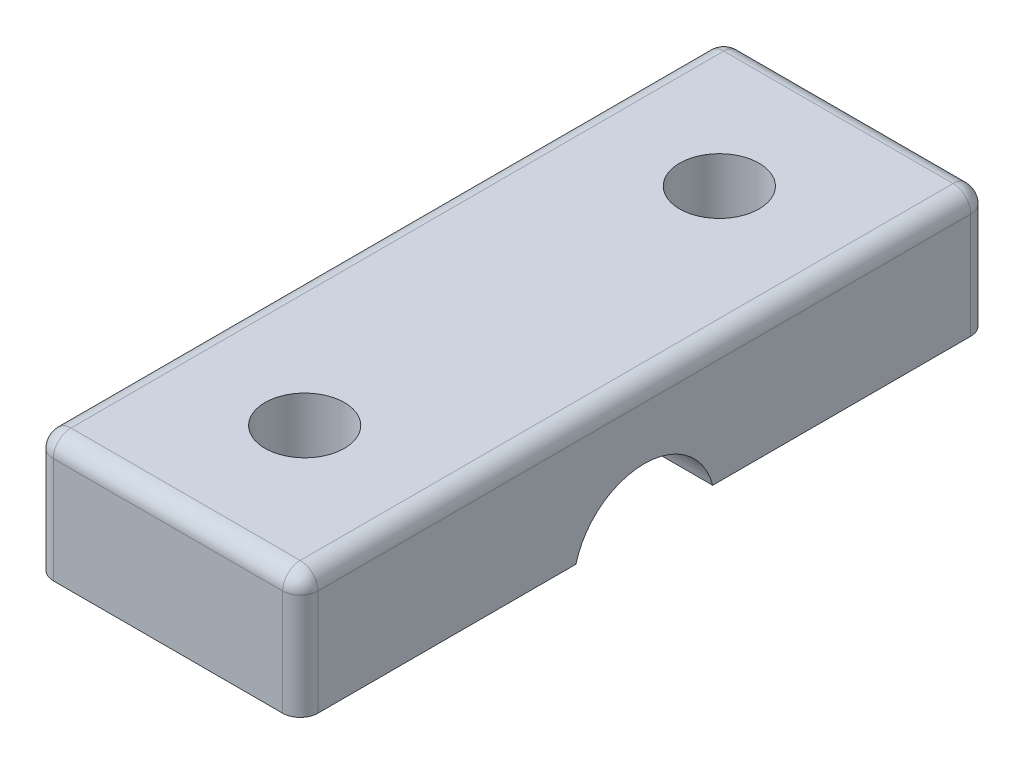
ISO-10303-21;
HEADER;
FILE_DESCRIPTION(('STEP AP214'),'2;1');
FILE_NAME('part.step','',(''),(''),'','','');
FILE_SCHEMA(('AUTOMOTIVE_DESIGN { 1 0 10303 214 1 1 1 1 }'));
ENDSEC;
DATA;
#1=APPLICATION_CONTEXT('core data for automotive mechanical design processes');
#2=APPLICATION_PROTOCOL_DEFINITION('international standard','automotive_design',2000,#1);
#3=PRODUCT_CONTEXT('',#1,'mechanical');
#4=PRODUCT('Part','Part','',(#3));
#5=PRODUCT_RELATED_PRODUCT_CATEGORY('part','',(#4));
#6=PRODUCT_DEFINITION_FORMATION('','',#4);
#7=PRODUCT_DEFINITION_CONTEXT('part definition',#1,'design');
#8=PRODUCT_DEFINITION('design','',#6,#7);
#9=PRODUCT_DEFINITION_SHAPE('','',#8);
#10=(LENGTH_UNIT() NAMED_UNIT(*) SI_UNIT(.MILLI.,.METRE.));
#11=(NAMED_UNIT(*) PLANE_ANGLE_UNIT() SI_UNIT($,.RADIAN.));
#12=(NAMED_UNIT(*) SI_UNIT($,.STERADIAN.) SOLID_ANGLE_UNIT());
#13=UNCERTAINTY_MEASURE_WITH_UNIT(LENGTH_MEASURE(1.E-05),#10,'distance_accuracy_value','');
#14=(GEOMETRIC_REPRESENTATION_CONTEXT(3) GLOBAL_UNCERTAINTY_ASSIGNED_CONTEXT((#13)) GLOBAL_UNIT_ASSIGNED_CONTEXT((#10,
#11,#12)) REPRESENTATION_CONTEXT('',''));
#15=CARTESIAN_POINT('',(0.,0.,0.));
#16=DIRECTION('',(0.,0.,1.));
#17=DIRECTION('',(1.,0.,0.));
#18=AXIS2_PLACEMENT_3D('',#15,#16,#17);
#19=CARTESIAN_POINT('',(0.,8.,0.));
#20=DIRECTION('',(0.,1.,0.));
#21=DIRECTION('',(0.,0.,1.));
#22=AXIS2_PLACEMENT_3D('',#19,#20,#21);
#23=PLANE('',#22);
#24=DIRECTION('',(0.,0.,-1.));
#25=VECTOR('',#24,1.);
#26=CARTESIAN_POINT('',(14.,8.,-39.));
#27=LINE('',#26,#25);
#28=CARTESIAN_POINT('',(14.,8.,-1.));
#29=VERTEX_POINT('',#28);
#30=CARTESIAN_POINT('',(14.,8.,-38.));
#31=VERTEX_POINT('',#30);
#32=EDGE_CURVE('E179',#29,#31,#27,.T.);
#33=ORIENTED_EDGE('',*,*,#32,.T.);
#34=DIRECTION('',(-1.,0.,0.));
#35=VECTOR('',#34,1.);
#36=CARTESIAN_POINT('',(0.,8.,-38.));
#37=LINE('',#36,#35);
#38=CARTESIAN_POINT('',(1.,8.,-38.));
#39=VERTEX_POINT('',#38);
#40=EDGE_CURVE('E183',#31,#39,#37,.T.);
#41=ORIENTED_EDGE('',*,*,#40,.T.);
#42=DIRECTION('',(0.,0.,1.));
#43=VECTOR('',#42,1.);
#44=CARTESIAN_POINT('',(1.,8.,0.));
#45=LINE('',#44,#43);
#46=CARTESIAN_POINT('',(1.,8.,-1.));
#47=VERTEX_POINT('',#46);
#48=EDGE_CURVE('E181',#39,#47,#45,.T.);
#49=ORIENTED_EDGE('',*,*,#48,.T.);
#50=DIRECTION('',(1.,0.,0.));
#51=VECTOR('',#50,1.);
#52=CARTESIAN_POINT('',(15.,8.,-1.));
#53=LINE('',#52,#51);
#54=EDGE_CURVE('E177',#47,#29,#53,.T.);
#55=ORIENTED_EDGE('',*,*,#54,.T.);
#56=EDGE_LOOP('',(#33,#41,#49,#55));
#57=FACE_BOUND('',#56,.T.);
#58=CARTESIAN_POINT('',(7.5,8.,-31.25));
#59=DIRECTION('',(0.,1.,0.));
#60=DIRECTION('',(0.,0.,1.));
#61=AXIS2_PLACEMENT_3D('',#58,#59,#60);
#62=CIRCLE('',#61,2.25);
#63=CARTESIAN_POINT('',(7.5,8.,-29.));
#64=VERTEX_POINT('',#63);
#65=EDGE_CURVE('E173',#64,#64,#62,.T.);
#66=ORIENTED_EDGE('',*,*,#65,.F.);
#67=EDGE_LOOP('',(#66));
#68=FACE_BOUND('',#67,.T.);
#69=CARTESIAN_POINT('',(7.5,8.,-7.75));
#70=DIRECTION('',(0.,1.,0.));
#71=DIRECTION('',(0.,0.,-1.));
#72=AXIS2_PLACEMENT_3D('',#69,#70,#71);
#73=CIRCLE('',#72,2.25);
#74=CARTESIAN_POINT('',(7.5,8.,-10.));
#75=VERTEX_POINT('',#74);
#76=EDGE_CURVE('E170',#75,#75,#73,.T.);
#77=ORIENTED_EDGE('',*,*,#76,.F.);
#78=EDGE_LOOP('',(#77));
#79=FACE_BOUND('',#78,.T.);
#80=ADVANCED_FACE('F36',(#57,#68,#79),#23,.T.);
#81=CARTESIAN_POINT('',(0.,8.,-39.));
#82=DIRECTION('',(1.,0.,0.));
#83=DIRECTION('',(0.,0.,-1.));
#84=AXIS2_PLACEMENT_3D('',#81,#82,#83);
#85=PLANE('',#84);
#86=CARTESIAN_POINT('',(0.,0.,-19.5));
#87=DIRECTION('',(-1.,0.,0.));
#88=DIRECTION('',(0.,0.,-1.));
#89=AXIS2_PLACEMENT_3D('',#86,#87,#88);
#90=CIRCLE('',#89,4.);
#91=CARTESIAN_POINT('',(0.,1.,-15.6270166537926));
#92=VERTEX_POINT('',#91);
#93=CARTESIAN_POINT('',(0.,1.,-23.3729833462074));
#94=VERTEX_POINT('',#93);
#95=EDGE_CURVE('E135',#92,#94,#90,.T.);
#96=ORIENTED_EDGE('',*,*,#95,.F.);
#97=DIRECTION('',(0.,0.,-1.));
#98=VECTOR('',#97,1.);
#99=CARTESIAN_POINT('',(0.,1.,4.69760280411851));
#100=LINE('',#99,#98);
#101=CARTESIAN_POINT('',(0.,1.,-1.));
#102=VERTEX_POINT('',#101);
#103=EDGE_CURVE('E131',#102,#92,#100,.T.);
#104=ORIENTED_EDGE('',*,*,#103,.F.);
#105=DIRECTION('',(0.,-1.,0.));
#106=VECTOR('',#105,1.);
#107=CARTESIAN_POINT('',(0.,8.,-1.));
#108=LINE('',#107,#106);
#109=CARTESIAN_POINT('',(0.,7.,-1.));
#110=VERTEX_POINT('',#109);
#111=EDGE_CURVE('E197',#102,#110,#108,.F.);
#112=ORIENTED_EDGE('',*,*,#111,.T.);
#113=DIRECTION('',(0.,0.,1.));
#114=VECTOR('',#113,1.);
#115=CARTESIAN_POINT('',(0.,7.,-39.));
#116=LINE('',#115,#114);
#117=CARTESIAN_POINT('',(0.,7.,-38.));
#118=VERTEX_POINT('',#117);
#119=EDGE_CURVE('E195',#110,#118,#116,.F.);
#120=ORIENTED_EDGE('',*,*,#119,.T.);
#121=DIRECTION('',(0.,-1.,0.));
#122=VECTOR('',#121,1.);
#123=CARTESIAN_POINT('',(0.,8.,-38.));
#124=LINE('',#123,#122);
#125=CARTESIAN_POINT('',(0.,1.,-38.));
#126=VERTEX_POINT('',#125);
#127=EDGE_CURVE('E144',#118,#126,#124,.T.);
#128=ORIENTED_EDGE('',*,*,#127,.T.);
#129=DIRECTION('',(0.,0.,-1.));
#130=VECTOR('',#129,1.);
#131=CARTESIAN_POINT('',(0.,1.,-23.3729833462074));
#132=LINE('',#131,#130);
#133=EDGE_CURVE('E51',#94,#126,#132,.T.);
#134=ORIENTED_EDGE('',*,*,#133,.F.);
#135=EDGE_LOOP('',(#96,#104,#112,#120,#128,#134));
#136=FACE_BOUND('',#135,.T.);
#137=ADVANCED_FACE('F142',(#136),#85,.F.);
#138=CARTESIAN_POINT('',(0.,8.,0.));
#139=DIRECTION('',(0.,0.,-1.));
#140=DIRECTION('',(-1.,0.,0.));
#141=AXIS2_PLACEMENT_3D('',#138,#139,#140);
#142=PLANE('',#141);
#143=DIRECTION('',(0.,-1.,0.));
#144=VECTOR('',#143,1.);
#145=CARTESIAN_POINT('',(1.,8.,0.));
#146=LINE('',#145,#144);
#147=CARTESIAN_POINT('',(1.,7.,0.));
#148=VERTEX_POINT('',#147);
#149=CARTESIAN_POINT('',(1.,1.,0.));
#150=VERTEX_POINT('',#149);
#151=EDGE_CURVE('E209',#148,#150,#146,.T.);
#152=ORIENTED_EDGE('',*,*,#151,.T.);
#153=DIRECTION('',(1.,0.,0.));
#154=VECTOR('',#153,1.);
#155=CARTESIAN_POINT('',(0.,1.,0.));
#156=LINE('',#155,#154);
#157=CARTESIAN_POINT('',(14.,1.,0.));
#158=VERTEX_POINT('',#157);
#159=EDGE_CURVE('E161',#150,#158,#156,.T.);
#160=ORIENTED_EDGE('',*,*,#159,.T.);
#161=DIRECTION('',(0.,-1.,0.));
#162=VECTOR('',#161,1.);
#163=CARTESIAN_POINT('',(14.,8.,0.));
#164=LINE('',#163,#162);
#165=CARTESIAN_POINT('',(14.,7.,0.));
#166=VERTEX_POINT('',#165);
#167=EDGE_CURVE('E206',#158,#166,#164,.F.);
#168=ORIENTED_EDGE('',*,*,#167,.T.);
#169=DIRECTION('',(1.,0.,0.));
#170=VECTOR('',#169,1.);
#171=CARTESIAN_POINT('',(0.,7.,0.));
#172=LINE('',#171,#170);
#173=EDGE_CURVE('E59',#166,#148,#172,.F.);
#174=ORIENTED_EDGE('',*,*,#173,.T.);
#175=EDGE_LOOP('',(#152,#160,#168,#174));
#176=FACE_BOUND('',#175,.T.);
#177=ADVANCED_FACE('F290',(#176),#142,.F.);
#178=CARTESIAN_POINT('',(15.,8.,-39.));
#179=DIRECTION('',(-1.,0.,0.));
#180=DIRECTION('',(0.,0.,1.));
#181=AXIS2_PLACEMENT_3D('',#178,#179,#180);
#182=PLANE('',#181);
#183=DIRECTION('',(0.,-1.,0.));
#184=VECTOR('',#183,1.);
#185=CARTESIAN_POINT('',(15.,8.,-1.));
#186=LINE('',#185,#184);
#187=CARTESIAN_POINT('',(15.,7.,-1.));
#188=VERTEX_POINT('',#187);
#189=CARTESIAN_POINT('',(15.,1.,-1.));
#190=VERTEX_POINT('',#189);
#191=EDGE_CURVE('E203',#188,#190,#186,.T.);
#192=ORIENTED_EDGE('',*,*,#191,.T.);
#193=DIRECTION('',(0.,0.,1.));
#194=VECTOR('',#193,1.);
#195=CARTESIAN_POINT('',(15.,1.,4.69760280411851));
#196=LINE('',#195,#194);
#197=CARTESIAN_POINT('',(15.,1.,-15.6270166537926));
#198=VERTEX_POINT('',#197);
#199=EDGE_CURVE('E149',#198,#190,#196,.T.);
#200=ORIENTED_EDGE('',*,*,#199,.F.);
#201=CARTESIAN_POINT('',(15.,0.,-19.5));
#202=DIRECTION('',(-1.,0.,0.));
#203=DIRECTION('',(0.,0.,1.));
#204=AXIS2_PLACEMENT_3D('',#201,#202,#203);
#205=CIRCLE('',#204,4.);
#206=CARTESIAN_POINT('',(15.,1.,-23.3729833462074));
#207=VERTEX_POINT('',#206);
#208=EDGE_CURVE('E153',#207,#198,#205,.F.);
#209=ORIENTED_EDGE('',*,*,#208,.F.);
#210=DIRECTION('',(0.,0.,1.));
#211=VECTOR('',#210,1.);
#212=CARTESIAN_POINT('',(15.,1.,-23.3729833462074));
#213=LINE('',#212,#211);
#214=CARTESIAN_POINT('',(15.,1.,-38.));
#215=VERTEX_POINT('',#214);
#216=EDGE_CURVE('E127',#215,#207,#213,.T.);
#217=ORIENTED_EDGE('',*,*,#216,.F.);
#218=DIRECTION('',(0.,-1.,0.));
#219=VECTOR('',#218,1.);
#220=CARTESIAN_POINT('',(15.,8.,-38.));
#221=LINE('',#220,#219);
#222=CARTESIAN_POINT('',(15.,7.,-38.));
#223=VERTEX_POINT('',#222);
#224=EDGE_CURVE('E199',#215,#223,#221,.F.);
#225=ORIENTED_EDGE('',*,*,#224,.T.);
#226=DIRECTION('',(0.,0.,-1.));
#227=VECTOR('',#226,1.);
#228=CARTESIAN_POINT('',(15.,7.,0.));
#229=LINE('',#228,#227);
#230=EDGE_CURVE('E201',#223,#188,#229,.F.);
#231=ORIENTED_EDGE('',*,*,#230,.T.);
#232=EDGE_LOOP('',(#192,#200,#209,#217,#225,#231));
#233=FACE_BOUND('',#232,.T.);
#234=ADVANCED_FACE('F280',(#233),#182,.F.);
#235=CARTESIAN_POINT('',(0.,8.,-39.));
#236=DIRECTION('',(0.,0.,1.));
#237=DIRECTION('',(1.,0.,0.));
#238=AXIS2_PLACEMENT_3D('',#235,#236,#237);
#239=PLANE('',#238);
#240=DIRECTION('',(0.,-1.,0.));
#241=VECTOR('',#240,1.);
#242=CARTESIAN_POINT('',(14.,8.,-39.));
#243=LINE('',#242,#241);
#244=CARTESIAN_POINT('',(14.,7.,-39.));
#245=VERTEX_POINT('',#244);
#246=CARTESIAN_POINT('',(14.,1.,-39.));
#247=VERTEX_POINT('',#246);
#248=EDGE_CURVE('E191',#245,#247,#243,.T.);
#249=ORIENTED_EDGE('',*,*,#248,.T.);
#250=DIRECTION('',(-1.,0.,0.));
#251=VECTOR('',#250,1.);
#252=CARTESIAN_POINT('',(0.,1.,-39.));
#253=LINE('',#252,#251);
#254=CARTESIAN_POINT('',(1.,1.,-39.));
#255=VERTEX_POINT('',#254);
#256=EDGE_CURVE('E152',#247,#255,#253,.T.);
#257=ORIENTED_EDGE('',*,*,#256,.T.);
#258=DIRECTION('',(0.,-1.,0.));
#259=VECTOR('',#258,1.);
#260=CARTESIAN_POINT('',(1.,8.,-39.));
#261=LINE('',#260,#259);
#262=CARTESIAN_POINT('',(1.,7.,-39.));
#263=VERTEX_POINT('',#262);
#264=EDGE_CURVE('E186',#255,#263,#261,.F.);
#265=ORIENTED_EDGE('',*,*,#264,.T.);
#266=DIRECTION('',(-1.,0.,0.));
#267=VECTOR('',#266,1.);
#268=CARTESIAN_POINT('',(15.,7.,-39.));
#269=LINE('',#268,#267);
#270=EDGE_CURVE('E188',#263,#245,#269,.F.);
#271=ORIENTED_EDGE('',*,*,#270,.T.);
#272=EDGE_LOOP('',(#249,#257,#265,#271));
#273=FACE_BOUND('',#272,.T.);
#274=ADVANCED_FACE('F246',(#273),#239,.F.);
#275=CARTESIAN_POINT('',(7.5,8.,-31.25));
#276=DIRECTION('',(0.,-1.,0.));
#277=DIRECTION('',(0.,0.,-1.));
#278=AXIS2_PLACEMENT_3D('',#275,#276,#277);
#279=CYLINDRICAL_SURFACE('',#278,2.25);
#280=CARTESIAN_POINT('',(7.5,1.,-31.25));
#281=DIRECTION('',(0.,1.,0.));
#282=DIRECTION('',(0.,0.,1.));
#283=AXIS2_PLACEMENT_3D('',#280,#281,#282);
#284=CIRCLE('',#283,2.25);
#285=CARTESIAN_POINT('',(7.5,1.,-29.));
#286=VERTEX_POINT('',#285);
#287=EDGE_CURVE('E158',#286,#286,#284,.T.);
#288=ORIENTED_EDGE('',*,*,#287,.F.);
#289=EDGE_LOOP('',(#288));
#290=FACE_BOUND('',#289,.T.);
#291=ORIENTED_EDGE('',*,*,#65,.T.);
#292=EDGE_LOOP('',(#291));
#293=FACE_BOUND('',#292,.T.);
#294=ADVANCED_FACE('F319',(#290,#293),#279,.F.);
#295=CARTESIAN_POINT('',(7.5,8.,-7.75));
#296=DIRECTION('',(0.,-1.,0.));
#297=DIRECTION('',(0.,0.,-1.));
#298=AXIS2_PLACEMENT_3D('',#295,#296,#297);
#299=CYLINDRICAL_SURFACE('',#298,2.25);
#300=CARTESIAN_POINT('',(7.5,1.,-7.75));
#301=DIRECTION('',(0.,1.,0.));
#302=DIRECTION('',(0.,0.,1.));
#303=AXIS2_PLACEMENT_3D('',#300,#301,#302);
#304=CIRCLE('',#303,2.25);
#305=CARTESIAN_POINT('',(7.5,1.,-5.5));
#306=VERTEX_POINT('',#305);
#307=EDGE_CURVE('E166',#306,#306,#304,.T.);
#308=ORIENTED_EDGE('',*,*,#307,.F.);
#309=EDGE_LOOP('',(#308));
#310=FACE_BOUND('',#309,.T.);
#311=ORIENTED_EDGE('',*,*,#76,.T.);
#312=EDGE_LOOP('',(#311));
#313=FACE_BOUND('',#312,.T.);
#314=ADVANCED_FACE('F438',(#310,#313),#299,.F.);
#315=CARTESIAN_POINT('',(14.,8.,-1.));
#316=DIRECTION('',(0.,-1.,0.));
#317=DIRECTION('',(0.,0.,-1.));
#318=AXIS2_PLACEMENT_3D('',#315,#316,#317);
#319=CYLINDRICAL_SURFACE('',#318,1.);
#320=CARTESIAN_POINT('',(14.,1.,-1.));
#321=DIRECTION('',(0.,1.,0.));
#322=DIRECTION('',(0.,0.,1.));
#323=AXIS2_PLACEMENT_3D('',#320,#321,#322);
#324=CIRCLE('',#323,1.);
#325=EDGE_CURVE('E164',#190,#158,#324,.F.);
#326=ORIENTED_EDGE('',*,*,#325,.F.);
#327=ORIENTED_EDGE('',*,*,#191,.F.);
#328=CARTESIAN_POINT('',(14.,7.,-1.));
#329=DIRECTION('',(0.,1.,0.));
#330=DIRECTION('',(0.,0.,1.));
#331=AXIS2_PLACEMENT_3D('',#328,#329,#330);
#332=CIRCLE('',#331,1.);
#333=EDGE_CURVE('E174',#166,#188,#332,.T.);
#334=ORIENTED_EDGE('',*,*,#333,.F.);
#335=ORIENTED_EDGE('',*,*,#167,.F.);
#336=EDGE_LOOP('',(#326,#327,#334,#335));
#337=FACE_BOUND('',#336,.T.);
#338=ADVANCED_FACE('F38',(#337),#319,.T.);
#339=CARTESIAN_POINT('',(0.,7.,-1.));
#340=DIRECTION('',(-1.,0.,0.));
#341=DIRECTION('',(0.,0.,1.));
#342=AXIS2_PLACEMENT_3D('',#339,#340,#341);
#343=CYLINDRICAL_SURFACE('',#342,1.);
#344=CARTESIAN_POINT('',(1.,7.,-1.));
#345=DIRECTION('',(-1.,0.,0.));
#346=DIRECTION('',(0.,0.,1.));
#347=AXIS2_PLACEMENT_3D('',#344,#345,#346);
#348=CIRCLE('',#347,1.);
#349=EDGE_CURVE('E235',#148,#47,#348,.T.);
#350=ORIENTED_EDGE('',*,*,#349,.F.);
#351=ORIENTED_EDGE('',*,*,#173,.F.);
#352=CARTESIAN_POINT('',(14.,7.,-1.));
#353=DIRECTION('',(1.,0.,0.));
#354=DIRECTION('',(0.,0.,-1.));
#355=AXIS2_PLACEMENT_3D('',#352,#353,#354);
#356=CIRCLE('',#355,1.);
#357=EDGE_CURVE('E238',#29,#166,#356,.T.);
#358=ORIENTED_EDGE('',*,*,#357,.F.);
#359=ORIENTED_EDGE('',*,*,#54,.F.);
#360=EDGE_LOOP('',(#350,#351,#358,#359));
#361=FACE_BOUND('',#360,.T.);
#362=ADVANCED_FACE('F293',(#361),#343,.T.);
#363=CARTESIAN_POINT('',(1.,8.,-1.));
#364=DIRECTION('',(0.,-1.,0.));
#365=DIRECTION('',(0.,0.,-1.));
#366=AXIS2_PLACEMENT_3D('',#363,#364,#365);
#367=CYLINDRICAL_SURFACE('',#366,1.);
#368=CARTESIAN_POINT('',(1.,1.,-1.));
#369=DIRECTION('',(0.,1.,0.));
#370=DIRECTION('',(0.,0.,1.));
#371=AXIS2_PLACEMENT_3D('',#368,#369,#370);
#372=CIRCLE('',#371,1.);
#373=EDGE_CURVE('E11',#150,#102,#372,.F.);
#374=ORIENTED_EDGE('',*,*,#373,.F.);
#375=ORIENTED_EDGE('',*,*,#151,.F.);
#376=CARTESIAN_POINT('',(1.,7.,-1.));
#377=DIRECTION('',(0.,1.,0.));
#378=DIRECTION('',(0.,0.,1.));
#379=AXIS2_PLACEMENT_3D('',#376,#377,#378);
#380=CIRCLE('',#379,1.);
#381=EDGE_CURVE('E232',#110,#148,#380,.T.);
#382=ORIENTED_EDGE('',*,*,#381,.F.);
#383=ORIENTED_EDGE('',*,*,#111,.F.);
#384=EDGE_LOOP('',(#374,#375,#382,#383));
#385=FACE_BOUND('',#384,.T.);
#386=ADVANCED_FACE('F301',(#385),#367,.T.);
#387=CARTESIAN_POINT('',(14.,7.,-1.));
#388=DIRECTION('',(0.,0.,1.));
#389=DIRECTION('',(1.,0.,0.));
#390=AXIS2_PLACEMENT_3D('',#387,#388,#389);
#391=SPHERICAL_SURFACE('',#390,1.);
#392=ORIENTED_EDGE('',*,*,#357,.T.);
#393=ORIENTED_EDGE('',*,*,#333,.T.);
#394=CARTESIAN_POINT('',(14.,7.,-1.));
#395=DIRECTION('',(0.,0.,1.));
#396=DIRECTION('',(0.,-1.,0.));
#397=AXIS2_PLACEMENT_3D('',#394,#395,#396);
#398=CIRCLE('',#397,1.);
#399=EDGE_CURVE('E229',#29,#188,#398,.F.);
#400=ORIENTED_EDGE('',*,*,#399,.F.);
#401=EDGE_LOOP('',(#392,#393,#400));
#402=FACE_BOUND('',#401,.T.);
#403=ADVANCED_FACE('F303',(#402),#391,.T.);
#404=CARTESIAN_POINT('',(1.,7.,-1.));
#405=DIRECTION('',(0.,0.,1.));
#406=DIRECTION('',(1.,0.,0.));
#407=AXIS2_PLACEMENT_3D('',#404,#405,#406);
#408=SPHERICAL_SURFACE('',#407,1.);
#409=ORIENTED_EDGE('',*,*,#381,.T.);
#410=ORIENTED_EDGE('',*,*,#349,.T.);
#411=CARTESIAN_POINT('',(1.,7.,-1.));
#412=DIRECTION('',(0.,0.,1.));
#413=DIRECTION('',(1.,0.,0.));
#414=AXIS2_PLACEMENT_3D('',#411,#412,#413);
#415=CIRCLE('',#414,1.);
#416=EDGE_CURVE('E226',#110,#47,#415,.F.);
#417=ORIENTED_EDGE('',*,*,#416,.F.);
#418=EDGE_LOOP('',(#409,#410,#417));
#419=FACE_BOUND('',#418,.T.);
#420=ADVANCED_FACE('F297',(#419),#408,.T.);
#421=CARTESIAN_POINT('',(14.,8.,-38.));
#422=DIRECTION('',(0.,-1.,0.));
#423=DIRECTION('',(0.,0.,-1.));
#424=AXIS2_PLACEMENT_3D('',#421,#422,#423);
#425=CYLINDRICAL_SURFACE('',#424,1.);
#426=CARTESIAN_POINT('',(14.,1.,-38.));
#427=DIRECTION('',(0.,1.,0.));
#428=DIRECTION('',(0.,0.,1.));
#429=AXIS2_PLACEMENT_3D('',#426,#427,#428);
#430=CIRCLE('',#429,1.);
#431=EDGE_CURVE('E156',#247,#215,#430,.F.);
#432=ORIENTED_EDGE('',*,*,#431,.F.);
#433=ORIENTED_EDGE('',*,*,#248,.F.);
#434=CARTESIAN_POINT('',(14.,7.,-38.));
#435=DIRECTION('',(0.,1.,0.));
#436=DIRECTION('',(0.,0.,1.));
#437=AXIS2_PLACEMENT_3D('',#434,#435,#436);
#438=CIRCLE('',#437,1.);
#439=EDGE_CURVE('E223',#223,#245,#438,.T.);
#440=ORIENTED_EDGE('',*,*,#439,.F.);
#441=ORIENTED_EDGE('',*,*,#224,.F.);
#442=EDGE_LOOP('',(#432,#433,#440,#441));
#443=FACE_BOUND('',#442,.T.);
#444=ADVANCED_FACE('F278',(#443),#425,.T.);
#445=CARTESIAN_POINT('',(14.,7.,0.));
#446=DIRECTION('',(0.,0.,1.));
#447=DIRECTION('',(1.,0.,0.));
#448=AXIS2_PLACEMENT_3D('',#445,#446,#447);
#449=CYLINDRICAL_SURFACE('',#448,1.);
#450=ORIENTED_EDGE('',*,*,#399,.T.);
#451=ORIENTED_EDGE('',*,*,#230,.F.);
#452=CARTESIAN_POINT('',(14.,7.,-38.));
#453=DIRECTION('',(0.,0.,-1.));
#454=DIRECTION('',(-1.,0.,0.));
#455=AXIS2_PLACEMENT_3D('',#452,#453,#454);
#456=CIRCLE('',#455,1.);
#457=EDGE_CURVE('E220',#31,#223,#456,.T.);
#458=ORIENTED_EDGE('',*,*,#457,.F.);
#459=ORIENTED_EDGE('',*,*,#32,.F.);
#460=EDGE_LOOP('',(#450,#451,#458,#459));
#461=FACE_BOUND('',#460,.T.);
#462=ADVANCED_FACE('F272',(#461),#449,.T.);
#463=CARTESIAN_POINT('',(1.,7.,0.));
#464=DIRECTION('',(0.,0.,-1.));
#465=DIRECTION('',(-1.,0.,0.));
#466=AXIS2_PLACEMENT_3D('',#463,#464,#465);
#467=CYLINDRICAL_SURFACE('',#466,1.);
#468=ORIENTED_EDGE('',*,*,#416,.T.);
#469=ORIENTED_EDGE('',*,*,#48,.F.);
#470=CARTESIAN_POINT('',(1.,7.,-38.));
#471=DIRECTION('',(0.,0.,-1.));
#472=DIRECTION('',(-1.,0.,0.));
#473=AXIS2_PLACEMENT_3D('',#470,#471,#472);
#474=CIRCLE('',#473,1.);
#475=EDGE_CURVE('E217',#118,#39,#474,.T.);
#476=ORIENTED_EDGE('',*,*,#475,.F.);
#477=ORIENTED_EDGE('',*,*,#119,.F.);
#478=EDGE_LOOP('',(#468,#469,#476,#477));
#479=FACE_BOUND('',#478,.T.);
#480=ADVANCED_FACE('F262',(#479),#467,.T.);
#481=CARTESIAN_POINT('',(1.,8.,-38.));
#482=DIRECTION('',(0.,-1.,0.));
#483=DIRECTION('',(0.,0.,-1.));
#484=AXIS2_PLACEMENT_3D('',#481,#482,#483);
#485=CYLINDRICAL_SURFACE('',#484,1.);
#486=CARTESIAN_POINT('',(1.,1.,-38.));
#487=DIRECTION('',(0.,1.,0.));
#488=DIRECTION('',(0.,0.,1.));
#489=AXIS2_PLACEMENT_3D('',#486,#487,#488);
#490=CIRCLE('',#489,1.);
#491=EDGE_CURVE('E44',#126,#255,#490,.F.);
#492=ORIENTED_EDGE('',*,*,#491,.F.);
#493=ORIENTED_EDGE('',*,*,#127,.F.);
#494=CARTESIAN_POINT('',(1.,7.,-38.));
#495=DIRECTION('',(0.,1.,0.));
#496=DIRECTION('',(0.,0.,1.));
#497=AXIS2_PLACEMENT_3D('',#494,#495,#496);
#498=CIRCLE('',#497,1.);
#499=EDGE_CURVE('E214',#263,#118,#498,.T.);
#500=ORIENTED_EDGE('',*,*,#499,.F.);
#501=ORIENTED_EDGE('',*,*,#264,.F.);
#502=EDGE_LOOP('',(#492,#493,#500,#501));
#503=FACE_BOUND('',#502,.T.);
#504=ADVANCED_FACE('F249',(#503),#485,.T.);
#505=CARTESIAN_POINT('',(14.,7.,-38.));
#506=DIRECTION('',(0.,0.,1.));
#507=DIRECTION('',(1.,0.,0.));
#508=AXIS2_PLACEMENT_3D('',#505,#506,#507);
#509=SPHERICAL_SURFACE('',#508,1.);
#510=ORIENTED_EDGE('',*,*,#457,.T.);
#511=ORIENTED_EDGE('',*,*,#439,.T.);
#512=CARTESIAN_POINT('',(14.,7.,-38.));
#513=DIRECTION('',(1.,0.,0.));
#514=DIRECTION('',(0.,0.,-1.));
#515=AXIS2_PLACEMENT_3D('',#512,#513,#514);
#516=CIRCLE('',#515,1.);
#517=EDGE_CURVE('E212',#31,#245,#516,.F.);
#518=ORIENTED_EDGE('',*,*,#517,.F.);
#519=EDGE_LOOP('',(#510,#511,#518));
#520=FACE_BOUND('',#519,.T.);
#521=ADVANCED_FACE('F275',(#520),#509,.T.);
#522=CARTESIAN_POINT('',(1.,7.,-38.));
#523=DIRECTION('',(0.,0.,1.));
#524=DIRECTION('',(1.,0.,0.));
#525=AXIS2_PLACEMENT_3D('',#522,#523,#524);
#526=SPHERICAL_SURFACE('',#525,1.);
#527=ORIENTED_EDGE('',*,*,#499,.T.);
#528=ORIENTED_EDGE('',*,*,#475,.T.);
#529=CARTESIAN_POINT('',(1.,7.,-38.));
#530=DIRECTION('',(-1.,0.,0.));
#531=DIRECTION('',(0.,0.,1.));
#532=AXIS2_PLACEMENT_3D('',#529,#530,#531);
#533=CIRCLE('',#532,1.);
#534=EDGE_CURVE('E169',#263,#39,#533,.F.);
#535=ORIENTED_EDGE('',*,*,#534,.F.);
#536=EDGE_LOOP('',(#527,#528,#535));
#537=FACE_BOUND('',#536,.T.);
#538=ADVANCED_FACE('F258',(#537),#526,.T.);
#539=CARTESIAN_POINT('',(0.,7.,-38.));
#540=DIRECTION('',(1.,0.,0.));
#541=DIRECTION('',(0.,0.,-1.));
#542=AXIS2_PLACEMENT_3D('',#539,#540,#541);
#543=CYLINDRICAL_SURFACE('',#542,1.);
#544=ORIENTED_EDGE('',*,*,#517,.T.);
#545=ORIENTED_EDGE('',*,*,#270,.F.);
#546=ORIENTED_EDGE('',*,*,#534,.T.);
#547=ORIENTED_EDGE('',*,*,#40,.F.);
#548=EDGE_LOOP('',(#544,#545,#546,#547));
#549=FACE_BOUND('',#548,.T.);
#550=ADVANCED_FACE('F255',(#549),#543,.T.);
#551=CARTESIAN_POINT('',(65.2493781056044,0.,-19.5));
#552=DIRECTION('',(-1.,0.,0.));
#553=DIRECTION('',(0.,0.,1.));
#554=AXIS2_PLACEMENT_3D('',#551,#552,#553);
#555=CYLINDRICAL_SURFACE('',#554,4.);
#556=ORIENTED_EDGE('',*,*,#208,.T.);
#557=DIRECTION('',(-1.,0.,0.));
#558=VECTOR('',#557,1.);
#559=CARTESIAN_POINT('',(65.2493781056044,1.,-15.6270166537926));
#560=LINE('',#559,#558);
#561=EDGE_CURVE('E130',#198,#92,#560,.T.);
#562=ORIENTED_EDGE('',*,*,#561,.T.);
#563=ORIENTED_EDGE('',*,*,#95,.T.);
#564=DIRECTION('',(-1.,0.,0.));
#565=VECTOR('',#564,1.);
#566=CARTESIAN_POINT('',(65.2493781056044,1.,-23.3729833462074));
#567=LINE('',#566,#565);
#568=EDGE_CURVE('E123',#207,#94,#567,.T.);
#569=ORIENTED_EDGE('',*,*,#568,.F.);
#570=EDGE_LOOP('',(#556,#562,#563,#569));
#571=FACE_BOUND('',#570,.T.);
#572=ADVANCED_FACE('F136',(#571),#555,.F.);
#573=CARTESIAN_POINT('',(65.2493781056044,1.,4.69760280411851));
#574=DIRECTION('',(0.,1.,0.));
#575=DIRECTION('',(0.,0.,1.));
#576=AXIS2_PLACEMENT_3D('',#573,#574,#575);
#577=PLANE('',#576);
#578=ORIENTED_EDGE('',*,*,#307,.T.);
#579=EDGE_LOOP('',(#578));
#580=FACE_BOUND('',#579,.T.);
#581=ORIENTED_EDGE('',*,*,#325,.T.);
#582=ORIENTED_EDGE('',*,*,#159,.F.);
#583=ORIENTED_EDGE('',*,*,#373,.T.);
#584=ORIENTED_EDGE('',*,*,#103,.T.);
#585=ORIENTED_EDGE('',*,*,#561,.F.);
#586=ORIENTED_EDGE('',*,*,#199,.T.);
#587=EDGE_LOOP('',(#581,#582,#583,#584,#585,#586));
#588=FACE_BOUND('',#587,.T.);
#589=ADVANCED_FACE('F285',(#580,#588),#577,.F.);
#590=CARTESIAN_POINT('',(65.2493781056044,1.,-23.3729833462074));
#591=DIRECTION('',(0.,1.,0.));
#592=DIRECTION('',(0.,0.,1.));
#593=AXIS2_PLACEMENT_3D('',#590,#591,#592);
#594=PLANE('',#593);
#595=ORIENTED_EDGE('',*,*,#287,.T.);
#596=EDGE_LOOP('',(#595));
#597=FACE_BOUND('',#596,.T.);
#598=ORIENTED_EDGE('',*,*,#431,.T.);
#599=ORIENTED_EDGE('',*,*,#216,.T.);
#600=ORIENTED_EDGE('',*,*,#568,.T.);
#601=ORIENTED_EDGE('',*,*,#133,.T.);
#602=ORIENTED_EDGE('',*,*,#491,.T.);
#603=ORIENTED_EDGE('',*,*,#256,.F.);
#604=EDGE_LOOP('',(#598,#599,#600,#601,#602,#603));
#605=FACE_BOUND('',#604,.T.);
#606=ADVANCED_FACE('F125',(#597,#605),#594,.F.);
#607=CLOSED_SHELL('',(#80,#137,#177,#234,#274,#294,#314,#338,#362,#386,#403,#420,#444,#462,#480,
#504,#521,#538,#550,#572,#589,#606));
#608=MANIFOLD_SOLID_BREP('B2',#607);
#609=ADVANCED_BREP_SHAPE_REPRESENTATION('',(#18,#608),#14);
#610=SHAPE_DEFINITION_REPRESENTATION(#9,#609);
ENDSEC;
END-ISO-10303-21;
